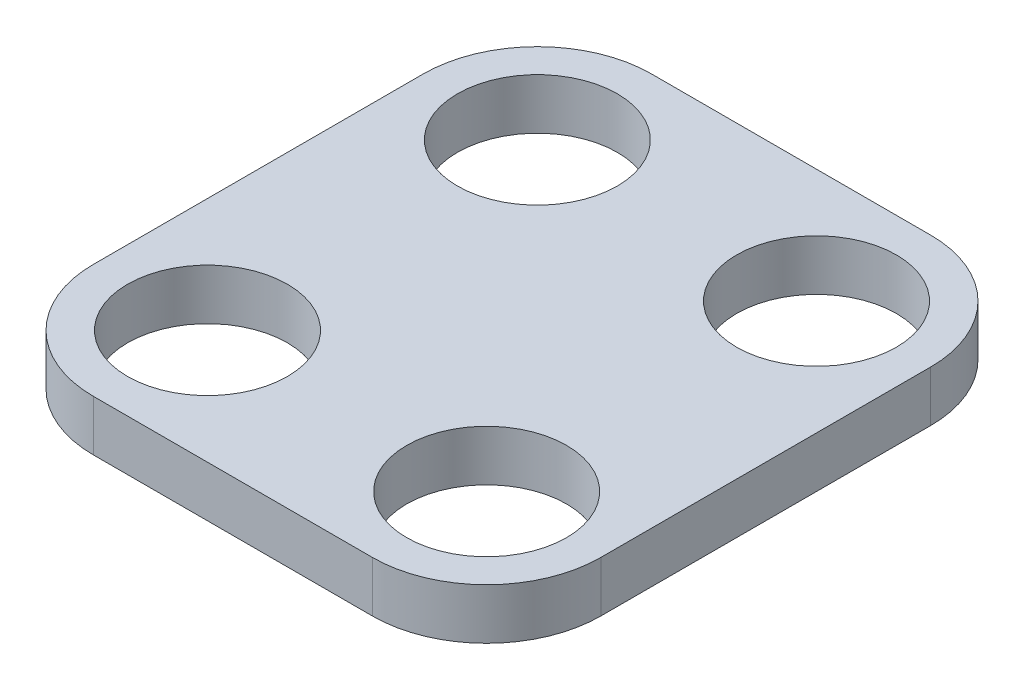
ISO-10303-21;
HEADER;
FILE_DESCRIPTION(('STEP AP214'),'2;1');
FILE_NAME('part.step','',(''),(''),'','','');
FILE_SCHEMA(('AUTOMOTIVE_DESIGN { 1 0 10303 214 1 1 1 1 }'));
ENDSEC;
DATA;
#1=APPLICATION_CONTEXT('core data for automotive mechanical design processes');
#2=APPLICATION_PROTOCOL_DEFINITION('international standard','automotive_design',2000,#1);
#3=PRODUCT_CONTEXT('',#1,'mechanical');
#4=PRODUCT('Part','Part','',(#3));
#5=PRODUCT_RELATED_PRODUCT_CATEGORY('part','',(#4));
#6=PRODUCT_DEFINITION_FORMATION('','',#4);
#7=PRODUCT_DEFINITION_CONTEXT('part definition',#1,'design');
#8=PRODUCT_DEFINITION('design','',#6,#7);
#9=PRODUCT_DEFINITION_SHAPE('','',#8);
#10=(LENGTH_UNIT() NAMED_UNIT(*) SI_UNIT(.MILLI.,.METRE.));
#11=(NAMED_UNIT(*) PLANE_ANGLE_UNIT() SI_UNIT($,.RADIAN.));
#12=(NAMED_UNIT(*) SI_UNIT($,.STERADIAN.) SOLID_ANGLE_UNIT());
#13=UNCERTAINTY_MEASURE_WITH_UNIT(LENGTH_MEASURE(1.E-05),#10,'distance_accuracy_value','');
#14=(GEOMETRIC_REPRESENTATION_CONTEXT(3) GLOBAL_UNCERTAINTY_ASSIGNED_CONTEXT((#13)) GLOBAL_UNIT_ASSIGNED_CONTEXT((#10,
#11,#12)) REPRESENTATION_CONTEXT('',''));
#15=CARTESIAN_POINT('',(0.,0.,0.));
#16=DIRECTION('',(0.,0.,1.));
#17=DIRECTION('',(1.,0.,0.));
#18=AXIS2_PLACEMENT_3D('',#15,#16,#17);
#19=CARTESIAN_POINT('',(0.553571831763054,-2.,35.9972684706334));
#20=DIRECTION('',(0.,1.,0.));
#21=DIRECTION('',(0.,0.,1.));
#22=AXIS2_PLACEMENT_3D('',#19,#20,#21);
#23=CYLINDRICAL_SURFACE('',#22,4.50000000000002);
#24=CARTESIAN_POINT('',(0.553571831763054,0.,35.9972684706334));
#25=DIRECTION('',(0.,1.,0.));
#26=DIRECTION('',(0.,0.,-1.));
#27=AXIS2_PLACEMENT_3D('',#24,#25,#26);
#28=CIRCLE('',#27,4.50000000000002);
#29=CARTESIAN_POINT('',(-3.94642816823694,0.,35.9972684706334));
#30=VERTEX_POINT('',#29);
#31=CARTESIAN_POINT('',(0.553571831763053,0.,40.4972684706334));
#32=VERTEX_POINT('',#31);
#33=EDGE_CURVE('E130',#30,#32,#28,.T.);
#34=ORIENTED_EDGE('',*,*,#33,.F.);
#35=DIRECTION('',(0.,1.,0.));
#36=VECTOR('',#35,1.);
#37=CARTESIAN_POINT('',(-3.94642816823694,-2.,35.9972684706334));
#38=LINE('',#37,#36);
#39=CARTESIAN_POINT('',(-3.94642816823694,-2.,35.9972684706334));
#40=VERTEX_POINT('',#39);
#41=EDGE_CURVE('E11',#40,#30,#38,.T.);
#42=ORIENTED_EDGE('',*,*,#41,.F.);
#43=CARTESIAN_POINT('',(0.553571831763054,-2.,35.9972684706334));
#44=DIRECTION('',(0.,1.,0.));
#45=DIRECTION('',(0.,0.,-1.));
#46=AXIS2_PLACEMENT_3D('',#43,#44,#45);
#47=CIRCLE('',#46,4.50000000000002);
#48=CARTESIAN_POINT('',(0.553571831763053,-2.,40.4972684706334));
#49=VERTEX_POINT('',#48);
#50=EDGE_CURVE('E151',#40,#49,#47,.T.);
#51=ORIENTED_EDGE('',*,*,#50,.T.);
#52=DIRECTION('',(0.,1.,0.));
#53=VECTOR('',#52,1.);
#54=CARTESIAN_POINT('',(0.553571831763053,-2.,40.4972684706334));
#55=LINE('',#54,#53);
#56=EDGE_CURVE('E36',#49,#32,#55,.T.);
#57=ORIENTED_EDGE('',*,*,#56,.T.);
#58=EDGE_LOOP('',(#34,#42,#51,#57));
#59=FACE_BOUND('',#58,.T.);
#60=ADVANCED_FACE('F33',(#59),#23,.T.);
#61=CARTESIAN_POINT('',(-3.94642816823694,-2.,22.9972684706334));
#62=DIRECTION('',(-1.,0.,0.));
#63=DIRECTION('',(0.,0.,1.));
#64=AXIS2_PLACEMENT_3D('',#61,#62,#63);
#65=PLANE('',#64);
#66=DIRECTION('',(0.,0.,1.));
#67=VECTOR('',#66,1.);
#68=CARTESIAN_POINT('',(-3.94642816823694,0.,22.9972684706334));
#69=LINE('',#68,#67);
#70=CARTESIAN_POINT('',(-3.94642816823694,0.,22.9972684706334));
#71=VERTEX_POINT('',#70);
#72=EDGE_CURVE('E149',#71,#30,#69,.T.);
#73=ORIENTED_EDGE('',*,*,#72,.F.);
#74=DIRECTION('',(0.,1.,0.));
#75=VECTOR('',#74,1.);
#76=CARTESIAN_POINT('',(-3.94642816823694,-2.,22.9972684706334));
#77=LINE('',#76,#75);
#78=CARTESIAN_POINT('',(-3.94642816823694,-2.,22.9972684706334));
#79=VERTEX_POINT('',#78);
#80=EDGE_CURVE('E42',#79,#71,#77,.T.);
#81=ORIENTED_EDGE('',*,*,#80,.F.);
#82=DIRECTION('',(0.,0.,1.));
#83=VECTOR('',#82,1.);
#84=CARTESIAN_POINT('',(-3.94642816823694,-2.,22.9972684706334));
#85=LINE('',#84,#83);
#86=EDGE_CURVE('E120',#79,#40,#85,.T.);
#87=ORIENTED_EDGE('',*,*,#86,.T.);
#88=ORIENTED_EDGE('',*,*,#41,.T.);
#89=EDGE_LOOP('',(#73,#81,#87,#88));
#90=FACE_BOUND('',#89,.T.);
#91=ADVANCED_FACE('F163',(#90),#65,.T.);
#92=CARTESIAN_POINT('',(0.553571831763054,-2.,22.9972684706334));
#93=DIRECTION('',(0.,1.,0.));
#94=DIRECTION('',(0.,0.,1.));
#95=AXIS2_PLACEMENT_3D('',#92,#93,#94);
#96=CYLINDRICAL_SURFACE('',#95,4.50000000000002);
#97=CARTESIAN_POINT('',(0.553571831763054,0.,22.9972684706334));
#98=DIRECTION('',(0.,1.,0.));
#99=DIRECTION('',(0.,0.,1.));
#100=AXIS2_PLACEMENT_3D('',#97,#98,#99);
#101=CIRCLE('',#100,4.50000000000002);
#102=CARTESIAN_POINT('',(0.553571831763055,0.,18.4972684706334));
#103=VERTEX_POINT('',#102);
#104=EDGE_CURVE('E107',#103,#71,#101,.T.);
#105=ORIENTED_EDGE('',*,*,#104,.F.);
#106=DIRECTION('',(0.,1.,0.));
#107=VECTOR('',#106,1.);
#108=CARTESIAN_POINT('',(0.553571831763055,-2.,18.4972684706334));
#109=LINE('',#108,#107);
#110=CARTESIAN_POINT('',(0.553571831763055,-2.,18.4972684706334));
#111=VERTEX_POINT('',#110);
#112=EDGE_CURVE('E102',#111,#103,#109,.T.);
#113=ORIENTED_EDGE('',*,*,#112,.F.);
#114=CARTESIAN_POINT('',(0.553571831763054,-2.,22.9972684706334));
#115=DIRECTION('',(0.,1.,0.));
#116=DIRECTION('',(0.,0.,1.));
#117=AXIS2_PLACEMENT_3D('',#114,#115,#116);
#118=CIRCLE('',#117,4.50000000000002);
#119=EDGE_CURVE('E105',#111,#79,#118,.T.);
#120=ORIENTED_EDGE('',*,*,#119,.T.);
#121=ORIENTED_EDGE('',*,*,#80,.T.);
#122=EDGE_LOOP('',(#105,#113,#120,#121));
#123=FACE_BOUND('',#122,.T.);
#124=ADVANCED_FACE('F104',(#123),#96,.T.);
#125=CARTESIAN_POINT('',(0.553571831763053,-2.,18.4972684706334));
#126=DIRECTION('',(0.,0.,-1.));
#127=DIRECTION('',(-1.,0.,0.));
#128=AXIS2_PLACEMENT_3D('',#125,#126,#127);
#129=PLANE('',#128);
#130=DIRECTION('',(-1.,0.,0.));
#131=VECTOR('',#130,1.);
#132=CARTESIAN_POINT('',(0.553571831763053,0.,18.4972684706334));
#133=LINE('',#132,#131);
#134=CARTESIAN_POINT('',(11.5535718317631,0.,18.4972684706334));
#135=VERTEX_POINT('',#134);
#136=EDGE_CURVE('E146',#135,#103,#133,.T.);
#137=ORIENTED_EDGE('',*,*,#136,.F.);
#138=DIRECTION('',(0.,1.,0.));
#139=VECTOR('',#138,1.);
#140=CARTESIAN_POINT('',(11.5535718317631,-2.,18.4972684706334));
#141=LINE('',#140,#139);
#142=CARTESIAN_POINT('',(11.5535718317631,-2.,18.4972684706334));
#143=VERTEX_POINT('',#142);
#144=EDGE_CURVE('E112',#143,#135,#141,.T.);
#145=ORIENTED_EDGE('',*,*,#144,.F.);
#146=DIRECTION('',(-1.,0.,0.));
#147=VECTOR('',#146,1.);
#148=CARTESIAN_POINT('',(0.553571831763053,-2.,18.4972684706334));
#149=LINE('',#148,#147);
#150=EDGE_CURVE('E118',#143,#111,#149,.T.);
#151=ORIENTED_EDGE('',*,*,#150,.T.);
#152=ORIENTED_EDGE('',*,*,#112,.T.);
#153=EDGE_LOOP('',(#137,#145,#151,#152));
#154=FACE_BOUND('',#153,.T.);
#155=ADVANCED_FACE('F122',(#154),#129,.T.);
#156=CARTESIAN_POINT('',(11.5535718317631,-2.,22.9972684706332));
#157=DIRECTION('',(0.,1.,0.));
#158=DIRECTION('',(0.,0.,1.));
#159=AXIS2_PLACEMENT_3D('',#156,#157,#158);
#160=CYLINDRICAL_SURFACE('',#159,4.4999999999999);
#161=CARTESIAN_POINT('',(11.5535718317631,0.,22.9972684706332));
#162=DIRECTION('',(0.,1.,0.));
#163=DIRECTION('',(0.,0.,-1.));
#164=AXIS2_PLACEMENT_3D('',#161,#162,#163);
#165=CIRCLE('',#164,4.4999999999999);
#166=CARTESIAN_POINT('',(16.053571831763,0.,22.9972684706334));
#167=VERTEX_POINT('',#166);
#168=EDGE_CURVE('E143',#167,#135,#165,.T.);
#169=ORIENTED_EDGE('',*,*,#168,.F.);
#170=DIRECTION('',(0.,1.,0.));
#171=VECTOR('',#170,1.);
#172=CARTESIAN_POINT('',(16.053571831763,-2.,22.9972684706334));
#173=LINE('',#172,#171);
#174=CARTESIAN_POINT('',(16.053571831763,-2.,22.9972684706334));
#175=VERTEX_POINT('',#174);
#176=EDGE_CURVE('E155',#175,#167,#173,.T.);
#177=ORIENTED_EDGE('',*,*,#176,.F.);
#178=CARTESIAN_POINT('',(11.5535718317631,-2.,22.9972684706332));
#179=DIRECTION('',(0.,1.,0.));
#180=DIRECTION('',(0.,0.,-1.));
#181=AXIS2_PLACEMENT_3D('',#178,#179,#180);
#182=CIRCLE('',#181,4.4999999999999);
#183=EDGE_CURVE('E123',#175,#143,#182,.T.);
#184=ORIENTED_EDGE('',*,*,#183,.T.);
#185=ORIENTED_EDGE('',*,*,#144,.T.);
#186=EDGE_LOOP('',(#169,#177,#184,#185));
#187=FACE_BOUND('',#186,.T.);
#188=ADVANCED_FACE('F176',(#187),#160,.T.);
#189=CARTESIAN_POINT('',(16.0535718317631,-2.,22.9972684706334));
#190=DIRECTION('',(1.,0.,0.));
#191=DIRECTION('',(0.,0.,-1.));
#192=AXIS2_PLACEMENT_3D('',#189,#190,#191);
#193=PLANE('',#192);
#194=DIRECTION('',(0.,0.,-1.));
#195=VECTOR('',#194,1.);
#196=CARTESIAN_POINT('',(16.0535718317631,0.,22.9972684706334));
#197=LINE('',#196,#195);
#198=CARTESIAN_POINT('',(16.0535718317631,0.,35.9972684706337));
#199=VERTEX_POINT('',#198);
#200=EDGE_CURVE('E140',#199,#167,#197,.T.);
#201=ORIENTED_EDGE('',*,*,#200,.F.);
#202=DIRECTION('',(0.,1.,0.));
#203=VECTOR('',#202,1.);
#204=CARTESIAN_POINT('',(16.0535718317631,-2.,35.9972684706337));
#205=LINE('',#204,#203);
#206=CARTESIAN_POINT('',(16.0535718317631,-2.,35.9972684706337));
#207=VERTEX_POINT('',#206);
#208=EDGE_CURVE('E157',#207,#199,#205,.T.);
#209=ORIENTED_EDGE('',*,*,#208,.F.);
#210=DIRECTION('',(0.,0.,-1.));
#211=VECTOR('',#210,1.);
#212=CARTESIAN_POINT('',(16.0535718317631,-2.,22.9972684706334));
#213=LINE('',#212,#211);
#214=EDGE_CURVE('E125',#207,#175,#213,.T.);
#215=ORIENTED_EDGE('',*,*,#214,.T.);
#216=ORIENTED_EDGE('',*,*,#176,.T.);
#217=EDGE_LOOP('',(#201,#209,#215,#216));
#218=FACE_BOUND('',#217,.T.);
#219=ADVANCED_FACE('F179',(#218),#193,.T.);
#220=CARTESIAN_POINT('',(11.5535718317631,-2.,35.9972684706334));
#221=DIRECTION('',(0.,1.,0.));
#222=DIRECTION('',(0.,0.,1.));
#223=AXIS2_PLACEMENT_3D('',#220,#221,#222);
#224=CYLINDRICAL_SURFACE('',#223,4.50000000000015);
#225=CARTESIAN_POINT('',(11.5535718317631,0.,35.9972684706334));
#226=DIRECTION('',(0.,1.,0.));
#227=DIRECTION('',(0.,0.,1.));
#228=AXIS2_PLACEMENT_3D('',#225,#226,#227);
#229=CIRCLE('',#228,4.50000000000015);
#230=CARTESIAN_POINT('',(11.5535718317631,0.,40.4972684706335));
#231=VERTEX_POINT('',#230);
#232=EDGE_CURVE('E137',#231,#199,#229,.T.);
#233=ORIENTED_EDGE('',*,*,#232,.F.);
#234=DIRECTION('',(0.,1.,0.));
#235=VECTOR('',#234,1.);
#236=CARTESIAN_POINT('',(11.5535718317631,-2.,40.4972684706335));
#237=LINE('',#236,#235);
#238=CARTESIAN_POINT('',(11.5535718317631,-2.,40.4972684706335));
#239=VERTEX_POINT('',#238);
#240=EDGE_CURVE('E158',#239,#231,#237,.T.);
#241=ORIENTED_EDGE('',*,*,#240,.F.);
#242=CARTESIAN_POINT('',(11.5535718317631,-2.,35.9972684706334));
#243=DIRECTION('',(0.,1.,0.));
#244=DIRECTION('',(0.,0.,1.));
#245=AXIS2_PLACEMENT_3D('',#242,#243,#244);
#246=CIRCLE('',#245,4.50000000000015);
#247=EDGE_CURVE('E245',#239,#207,#246,.T.);
#248=ORIENTED_EDGE('',*,*,#247,.T.);
#249=ORIENTED_EDGE('',*,*,#208,.T.);
#250=EDGE_LOOP('',(#233,#241,#248,#249));
#251=FACE_BOUND('',#250,.T.);
#252=ADVANCED_FACE('F183',(#251),#224,.T.);
#253=CARTESIAN_POINT('',(0.553571831763053,-2.,40.4972684706334));
#254=DIRECTION('',(0.,0.,1.));
#255=DIRECTION('',(1.,0.,0.));
#256=AXIS2_PLACEMENT_3D('',#253,#254,#255);
#257=PLANE('',#256);
#258=DIRECTION('',(1.,0.,0.));
#259=VECTOR('',#258,1.);
#260=CARTESIAN_POINT('',(0.553571831763053,0.,40.4972684706334));
#261=LINE('',#260,#259);
#262=EDGE_CURVE('E133',#32,#231,#261,.T.);
#263=ORIENTED_EDGE('',*,*,#262,.F.);
#264=ORIENTED_EDGE('',*,*,#56,.F.);
#265=DIRECTION('',(1.,0.,0.));
#266=VECTOR('',#265,1.);
#267=CARTESIAN_POINT('',(0.553571831763053,-2.,40.4972684706334));
#268=LINE('',#267,#266);
#269=EDGE_CURVE('E243',#49,#239,#268,.T.);
#270=ORIENTED_EDGE('',*,*,#269,.T.);
#271=ORIENTED_EDGE('',*,*,#240,.T.);
#272=EDGE_LOOP('',(#263,#264,#270,#271));
#273=FACE_BOUND('',#272,.T.);
#274=ADVANCED_FACE('F160',(#273),#257,.T.);
#275=CARTESIAN_POINT('',(0.553571831763054,-2.,35.9972684706334));
#276=DIRECTION('',(0.,-1.,0.));
#277=DIRECTION('',(0.,0.,-1.));
#278=AXIS2_PLACEMENT_3D('',#275,#276,#277);
#279=PLANE('',#278);
#280=CARTESIAN_POINT('',(11.5535718317631,-2.,22.9972684706332));
#281=DIRECTION('',(0.,1.,0.));
#282=DIRECTION('',(0.,0.,-1.));
#283=AXIS2_PLACEMENT_3D('',#280,#281,#282);
#284=CIRCLE('',#283,3.15);
#285=CARTESIAN_POINT('',(11.5535718317631,-2.,19.8472684706332));
#286=VERTEX_POINT('',#285);
#287=EDGE_CURVE('E218',#286,#286,#284,.T.);
#288=ORIENTED_EDGE('',*,*,#287,.T.);
#289=EDGE_LOOP('',(#288));
#290=FACE_BOUND('',#289,.T.);
#291=CARTESIAN_POINT('',(0.553571831763054,-2.,35.9972684706334));
#292=DIRECTION('',(0.,1.,0.));
#293=DIRECTION('',(0.,0.,-1.));
#294=AXIS2_PLACEMENT_3D('',#291,#292,#293);
#295=CIRCLE('',#294,3.15);
#296=CARTESIAN_POINT('',(0.553571831763054,-2.,32.8472684706334));
#297=VERTEX_POINT('',#296);
#298=EDGE_CURVE('E226',#297,#297,#295,.T.);
#299=ORIENTED_EDGE('',*,*,#298,.T.);
#300=EDGE_LOOP('',(#299));
#301=FACE_BOUND('',#300,.T.);
#302=CARTESIAN_POINT('',(11.5535718317631,-2.,35.9972684706334));
#303=DIRECTION('',(0.,1.,0.));
#304=DIRECTION('',(0.,0.,1.));
#305=AXIS2_PLACEMENT_3D('',#302,#303,#304);
#306=CIRCLE('',#305,3.15);
#307=CARTESIAN_POINT('',(11.5535718317631,-2.,39.1472684706334));
#308=VERTEX_POINT('',#307);
#309=EDGE_CURVE('E232',#308,#308,#306,.T.);
#310=ORIENTED_EDGE('',*,*,#309,.T.);
#311=EDGE_LOOP('',(#310));
#312=FACE_BOUND('',#311,.T.);
#313=CARTESIAN_POINT('',(0.553571831763054,-2.,22.9972684706334));
#314=DIRECTION('',(0.,1.,0.));
#315=DIRECTION('',(0.,0.,1.));
#316=AXIS2_PLACEMENT_3D('',#313,#314,#315);
#317=CIRCLE('',#316,3.15);
#318=CARTESIAN_POINT('',(0.553571831763054,-2.,26.1472684706334));
#319=VERTEX_POINT('',#318);
#320=EDGE_CURVE('E134',#319,#319,#317,.T.);
#321=ORIENTED_EDGE('',*,*,#320,.T.);
#322=EDGE_LOOP('',(#321));
#323=FACE_BOUND('',#322,.T.);
#324=ORIENTED_EDGE('',*,*,#50,.F.);
#325=ORIENTED_EDGE('',*,*,#86,.F.);
#326=ORIENTED_EDGE('',*,*,#119,.F.);
#327=ORIENTED_EDGE('',*,*,#150,.F.);
#328=ORIENTED_EDGE('',*,*,#183,.F.);
#329=ORIENTED_EDGE('',*,*,#214,.F.);
#330=ORIENTED_EDGE('',*,*,#247,.F.);
#331=ORIENTED_EDGE('',*,*,#269,.F.);
#332=EDGE_LOOP('',(#324,#325,#326,#327,#328,#329,#330,#331));
#333=FACE_BOUND('',#332,.T.);
#334=ADVANCED_FACE('F116',(#290,#301,#312,#323,#333),#279,.T.);
#335=CARTESIAN_POINT('',(0.553571831763054,0.,35.9972684706334));
#336=DIRECTION('',(0.,-1.,0.));
#337=DIRECTION('',(0.,0.,-1.));
#338=AXIS2_PLACEMENT_3D('',#335,#336,#337);
#339=PLANE('',#338);
#340=CARTESIAN_POINT('',(11.5535718317631,0.,22.9972684706332));
#341=DIRECTION('',(0.,1.,0.));
#342=DIRECTION('',(0.,0.,-1.));
#343=AXIS2_PLACEMENT_3D('',#340,#341,#342);
#344=CIRCLE('',#343,3.15);
#345=CARTESIAN_POINT('',(11.5535718317631,0.,19.8472684706332));
#346=VERTEX_POINT('',#345);
#347=EDGE_CURVE('E221',#346,#346,#344,.T.);
#348=ORIENTED_EDGE('',*,*,#347,.F.);
#349=EDGE_LOOP('',(#348));
#350=FACE_BOUND('',#349,.T.);
#351=CARTESIAN_POINT('',(0.553571831763054,0.,35.9972684706334));
#352=DIRECTION('',(0.,1.,0.));
#353=DIRECTION('',(0.,0.,-1.));
#354=AXIS2_PLACEMENT_3D('',#351,#352,#353);
#355=CIRCLE('',#354,3.15);
#356=CARTESIAN_POINT('',(0.553571831763054,0.,32.8472684706334));
#357=VERTEX_POINT('',#356);
#358=EDGE_CURVE('E223',#357,#357,#355,.T.);
#359=ORIENTED_EDGE('',*,*,#358,.F.);
#360=EDGE_LOOP('',(#359));
#361=FACE_BOUND('',#360,.T.);
#362=CARTESIAN_POINT('',(11.5535718317631,0.,35.9972684706334));
#363=DIRECTION('',(0.,1.,0.));
#364=DIRECTION('',(0.,0.,1.));
#365=AXIS2_PLACEMENT_3D('',#362,#363,#364);
#366=CIRCLE('',#365,3.15);
#367=CARTESIAN_POINT('',(11.5535718317631,0.,39.1472684706334));
#368=VERTEX_POINT('',#367);
#369=EDGE_CURVE('E229',#368,#368,#366,.T.);
#370=ORIENTED_EDGE('',*,*,#369,.F.);
#371=EDGE_LOOP('',(#370));
#372=FACE_BOUND('',#371,.T.);
#373=CARTESIAN_POINT('',(0.553571831763054,0.,22.9972684706334));
#374=DIRECTION('',(0.,1.,0.));
#375=DIRECTION('',(0.,0.,1.));
#376=AXIS2_PLACEMENT_3D('',#373,#374,#375);
#377=CIRCLE('',#376,3.15);
#378=CARTESIAN_POINT('',(0.553571831763054,0.,26.1472684706334));
#379=VERTEX_POINT('',#378);
#380=EDGE_CURVE('E235',#379,#379,#377,.T.);
#381=ORIENTED_EDGE('',*,*,#380,.F.);
#382=EDGE_LOOP('',(#381));
#383=FACE_BOUND('',#382,.T.);
#384=ORIENTED_EDGE('',*,*,#33,.T.);
#385=ORIENTED_EDGE('',*,*,#262,.T.);
#386=ORIENTED_EDGE('',*,*,#232,.T.);
#387=ORIENTED_EDGE('',*,*,#200,.T.);
#388=ORIENTED_EDGE('',*,*,#168,.T.);
#389=ORIENTED_EDGE('',*,*,#136,.T.);
#390=ORIENTED_EDGE('',*,*,#104,.T.);
#391=ORIENTED_EDGE('',*,*,#72,.T.);
#392=EDGE_LOOP('',(#384,#385,#386,#387,#388,#389,#390,#391));
#393=FACE_BOUND('',#392,.T.);
#394=ADVANCED_FACE('F162',(#350,#361,#372,#383,#393),#339,.F.);
#395=CARTESIAN_POINT('',(0.553571831763054,-2.,22.9972684706334));
#396=DIRECTION('',(0.,1.,0.));
#397=DIRECTION('',(0.,0.,1.));
#398=AXIS2_PLACEMENT_3D('',#395,#396,#397);
#399=CYLINDRICAL_SURFACE('',#398,3.15);
#400=ORIENTED_EDGE('',*,*,#320,.F.);
#401=EDGE_LOOP('',(#400));
#402=FACE_BOUND('',#401,.T.);
#403=ORIENTED_EDGE('',*,*,#380,.T.);
#404=EDGE_LOOP('',(#403));
#405=FACE_BOUND('',#404,.T.);
#406=ADVANCED_FACE('F195',(#402,#405),#399,.F.);
#407=CARTESIAN_POINT('',(11.5535718317631,-2.,35.9972684706334));
#408=DIRECTION('',(0.,1.,0.));
#409=DIRECTION('',(0.,0.,1.));
#410=AXIS2_PLACEMENT_3D('',#407,#408,#409);
#411=CYLINDRICAL_SURFACE('',#410,3.15);
#412=ORIENTED_EDGE('',*,*,#309,.F.);
#413=EDGE_LOOP('',(#412));
#414=FACE_BOUND('',#413,.T.);
#415=ORIENTED_EDGE('',*,*,#369,.T.);
#416=EDGE_LOOP('',(#415));
#417=FACE_BOUND('',#416,.T.);
#418=ADVANCED_FACE('F202',(#414,#417),#411,.F.);
#419=CARTESIAN_POINT('',(0.553571831763054,-2.,35.9972684706334));
#420=DIRECTION('',(0.,1.,0.));
#421=DIRECTION('',(0.,0.,1.));
#422=AXIS2_PLACEMENT_3D('',#419,#420,#421);
#423=CYLINDRICAL_SURFACE('',#422,3.15);
#424=ORIENTED_EDGE('',*,*,#298,.F.);
#425=EDGE_LOOP('',(#424));
#426=FACE_BOUND('',#425,.T.);
#427=ORIENTED_EDGE('',*,*,#358,.T.);
#428=EDGE_LOOP('',(#427));
#429=FACE_BOUND('',#428,.T.);
#430=ADVANCED_FACE('F206',(#426,#429),#423,.F.);
#431=CARTESIAN_POINT('',(11.5535718317631,-2.,22.9972684706332));
#432=DIRECTION('',(0.,1.,0.));
#433=DIRECTION('',(0.,0.,1.));
#434=AXIS2_PLACEMENT_3D('',#431,#432,#433);
#435=CYLINDRICAL_SURFACE('',#434,3.15);
#436=ORIENTED_EDGE('',*,*,#287,.F.);
#437=EDGE_LOOP('',(#436));
#438=FACE_BOUND('',#437,.T.);
#439=ORIENTED_EDGE('',*,*,#347,.T.);
#440=EDGE_LOOP('',(#439));
#441=FACE_BOUND('',#440,.T.);
#442=ADVANCED_FACE('F210',(#438,#441),#435,.F.);
#443=CLOSED_SHELL('',(#60,#91,#124,#155,#188,#219,#252,#274,#334,#394,#406,#418,#430,#442));
#444=MANIFOLD_SOLID_BREP('B2',#443);
#445=ADVANCED_BREP_SHAPE_REPRESENTATION('',(#18,#444),#14);
#446=SHAPE_DEFINITION_REPRESENTATION(#9,#445);
ENDSEC;
END-ISO-10303-21;
